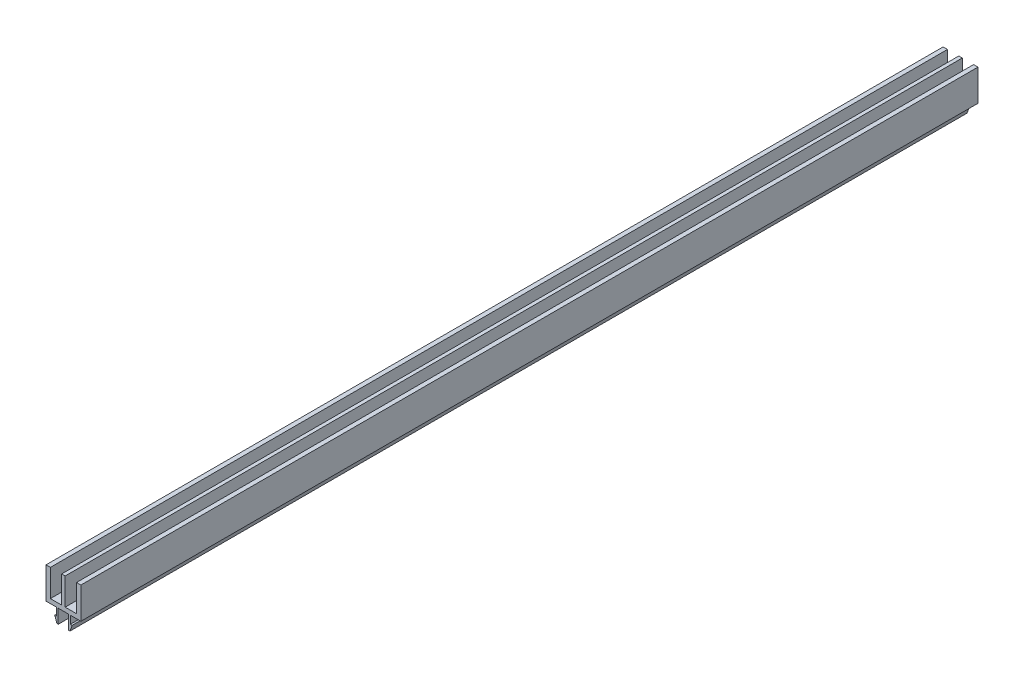
ISO-10303-21;
HEADER;
FILE_DESCRIPTION(('STEP AP214'),'2;1');
FILE_NAME('part.step','',(''),(''),'','','');
FILE_SCHEMA(('AUTOMOTIVE_DESIGN { 1 0 10303 214 1 1 1 1 }'));
ENDSEC;
DATA;
#1=APPLICATION_CONTEXT('core data for automotive mechanical design processes');
#2=APPLICATION_PROTOCOL_DEFINITION('international standard','automotive_design',2000,#1);
#3=PRODUCT_CONTEXT('',#1,'mechanical');
#4=PRODUCT('Part','Part','',(#3));
#5=PRODUCT_RELATED_PRODUCT_CATEGORY('part','',(#4));
#6=PRODUCT_DEFINITION_FORMATION('','',#4);
#7=PRODUCT_DEFINITION_CONTEXT('part definition',#1,'design');
#8=PRODUCT_DEFINITION('design','',#6,#7);
#9=PRODUCT_DEFINITION_SHAPE('','',#8);
#10=(LENGTH_UNIT() NAMED_UNIT(*) SI_UNIT(.MILLI.,.METRE.));
#11=(NAMED_UNIT(*) PLANE_ANGLE_UNIT() SI_UNIT($,.RADIAN.));
#12=(NAMED_UNIT(*) SI_UNIT($,.STERADIAN.) SOLID_ANGLE_UNIT());
#13=UNCERTAINTY_MEASURE_WITH_UNIT(LENGTH_MEASURE(1.E-05),#10,'distance_accuracy_value','');
#14=(GEOMETRIC_REPRESENTATION_CONTEXT(3) GLOBAL_UNCERTAINTY_ASSIGNED_CONTEXT((#13)) GLOBAL_UNIT_ASSIGNED_CONTEXT((#10,
#11,#12)) REPRESENTATION_CONTEXT('',''));
#15=CARTESIAN_POINT('',(0.,0.,0.));
#16=DIRECTION('',(0.,0.,1.));
#17=DIRECTION('',(1.,0.,0.));
#18=AXIS2_PLACEMENT_3D('',#15,#16,#17);
#19=CARTESIAN_POINT('',(-1.,17.9999999975,-464.));
#20=DIRECTION('',(-1.,0.,0.));
#21=DIRECTION('',(0.,-1.,0.));
#22=AXIS2_PLACEMENT_3D('',#19,#20,#21);
#23=PLANE('',#22);
#24=DIRECTION('',(0.,-1.,0.));
#25=VECTOR('',#24,1.);
#26=CARTESIAN_POINT('',(-1.,17.9999999975,50.));
#27=LINE('',#26,#25);
#28=CARTESIAN_POINT('',(-1.,17.9999999975,50.));
#29=VERTEX_POINT('',#28);
#30=CARTESIAN_POINT('',(-1.,2.4999999995,50.));
#31=VERTEX_POINT('',#30);
#32=EDGE_CURVE('E226',#29,#31,#27,.T.);
#33=ORIENTED_EDGE('',*,*,#32,.F.);
#34=DIRECTION('',(0.,0.,1.));
#35=VECTOR('',#34,1.);
#36=CARTESIAN_POINT('',(-1.,17.9999999975,-464.));
#37=LINE('',#36,#35);
#38=CARTESIAN_POINT('',(-1.,17.9999999975,-464.));
#39=VERTEX_POINT('',#38);
#40=EDGE_CURVE('E11',#39,#29,#37,.T.);
#41=ORIENTED_EDGE('',*,*,#40,.F.);
#42=DIRECTION('',(0.,-1.,0.));
#43=VECTOR('',#42,1.);
#44=CARTESIAN_POINT('',(-1.,17.9999999975,-464.));
#45=LINE('',#44,#43);
#46=CARTESIAN_POINT('',(-1.,2.4999999995,-464.));
#47=VERTEX_POINT('',#46);
#48=EDGE_CURVE('E294',#39,#47,#45,.T.);
#49=ORIENTED_EDGE('',*,*,#48,.T.);
#50=DIRECTION('',(0.,0.,1.));
#51=VECTOR('',#50,1.);
#52=CARTESIAN_POINT('',(-1.,2.4999999995,-464.));
#53=LINE('',#52,#51);
#54=EDGE_CURVE('E36',#47,#31,#53,.T.);
#55=ORIENTED_EDGE('',*,*,#54,.T.);
#56=EDGE_LOOP('',(#33,#41,#49,#55));
#57=FACE_BOUND('',#56,.T.);
#58=ADVANCED_FACE('F33',(#57),#23,.T.);
#59=CARTESIAN_POINT('',(0.999999999999998,17.9999999975,-464.));
#60=DIRECTION('',(0.,1.,0.));
#61=DIRECTION('',(0.,0.,1.));
#62=AXIS2_PLACEMENT_3D('',#59,#60,#61);
#63=PLANE('',#62);
#64=DIRECTION('',(-1.,0.,0.));
#65=VECTOR('',#64,1.);
#66=CARTESIAN_POINT('',(0.999999999999998,17.9999999975,50.));
#67=LINE('',#66,#65);
#68=CARTESIAN_POINT('',(0.999999999999998,17.9999999975,50.));
#69=VERTEX_POINT('',#68);
#70=EDGE_CURVE('E292',#69,#29,#67,.T.);
#71=ORIENTED_EDGE('',*,*,#70,.F.);
#72=DIRECTION('',(0.,0.,1.));
#73=VECTOR('',#72,1.);
#74=CARTESIAN_POINT('',(0.999999999999998,17.9999999975,-464.));
#75=LINE('',#74,#73);
#76=CARTESIAN_POINT('',(0.999999999999998,17.9999999975,-464.));
#77=VERTEX_POINT('',#76);
#78=EDGE_CURVE('E42',#77,#69,#75,.T.);
#79=ORIENTED_EDGE('',*,*,#78,.F.);
#80=DIRECTION('',(-1.,0.,0.));
#81=VECTOR('',#80,1.);
#82=CARTESIAN_POINT('',(0.999999999999998,17.9999999975,-464.));
#83=LINE('',#82,#81);
#84=EDGE_CURVE('E216',#77,#39,#83,.T.);
#85=ORIENTED_EDGE('',*,*,#84,.T.);
#86=ORIENTED_EDGE('',*,*,#40,.T.);
#87=EDGE_LOOP('',(#71,#79,#85,#86));
#88=FACE_BOUND('',#87,.T.);
#89=ADVANCED_FACE('F338',(#88),#63,.T.);
#90=CARTESIAN_POINT('',(0.999999999999998,2.4999999995,-464.));
#91=DIRECTION('',(1.,0.,0.));
#92=DIRECTION('',(0.,0.,-1.));
#93=AXIS2_PLACEMENT_3D('',#90,#91,#92);
#94=PLANE('',#93);
#95=DIRECTION('',(0.,1.,0.));
#96=VECTOR('',#95,1.);
#97=CARTESIAN_POINT('',(0.999999999999998,2.4999999995,50.));
#98=LINE('',#97,#96);
#99=CARTESIAN_POINT('',(0.999999999999998,2.4999999995,50.));
#100=VERTEX_POINT('',#99);
#101=EDGE_CURVE('E203',#100,#69,#98,.T.);
#102=ORIENTED_EDGE('',*,*,#101,.F.);
#103=DIRECTION('',(0.,0.,1.));
#104=VECTOR('',#103,1.);
#105=CARTESIAN_POINT('',(0.999999999999998,2.4999999995,-464.));
#106=LINE('',#105,#104);
#107=CARTESIAN_POINT('',(0.999999999999998,2.4999999995,-464.));
#108=VERTEX_POINT('',#107);
#109=EDGE_CURVE('E198',#108,#100,#106,.T.);
#110=ORIENTED_EDGE('',*,*,#109,.F.);
#111=DIRECTION('',(0.,1.,0.));
#112=VECTOR('',#111,1.);
#113=CARTESIAN_POINT('',(0.999999999999998,2.4999999995,-464.));
#114=LINE('',#113,#112);
#115=EDGE_CURVE('E201',#108,#77,#114,.T.);
#116=ORIENTED_EDGE('',*,*,#115,.T.);
#117=ORIENTED_EDGE('',*,*,#78,.T.);
#118=EDGE_LOOP('',(#102,#110,#116,#117));
#119=FACE_BOUND('',#118,.T.);
#120=ADVANCED_FACE('F200',(#119),#94,.T.);
#121=CARTESIAN_POINT('',(7.5,2.4999999995,-464.));
#122=DIRECTION('',(0.,1.,0.));
#123=DIRECTION('',(-1.,0.,0.));
#124=AXIS2_PLACEMENT_3D('',#121,#122,#123);
#125=PLANE('',#124);
#126=DIRECTION('',(-1.,0.,0.));
#127=VECTOR('',#126,1.);
#128=CARTESIAN_POINT('',(7.5,2.4999999995,50.));
#129=LINE('',#128,#127);
#130=CARTESIAN_POINT('',(7.5,2.4999999995,50.));
#131=VERTEX_POINT('',#130);
#132=EDGE_CURVE('E289',#131,#100,#129,.T.);
#133=ORIENTED_EDGE('',*,*,#132,.F.);
#134=DIRECTION('',(0.,0.,1.));
#135=VECTOR('',#134,1.);
#136=CARTESIAN_POINT('',(7.5,2.4999999995,-464.));
#137=LINE('',#136,#135);
#138=CARTESIAN_POINT('',(7.5,2.4999999995,-464.));
#139=VERTEX_POINT('',#138);
#140=EDGE_CURVE('E208',#139,#131,#137,.T.);
#141=ORIENTED_EDGE('',*,*,#140,.F.);
#142=DIRECTION('',(-1.,0.,0.));
#143=VECTOR('',#142,1.);
#144=CARTESIAN_POINT('',(7.5,2.4999999995,-464.));
#145=LINE('',#144,#143);
#146=EDGE_CURVE('E214',#139,#108,#145,.T.);
#147=ORIENTED_EDGE('',*,*,#146,.T.);
#148=ORIENTED_EDGE('',*,*,#109,.T.);
#149=EDGE_LOOP('',(#133,#141,#147,#148));
#150=FACE_BOUND('',#149,.T.);
#151=ADVANCED_FACE('F218',(#150),#125,.T.);
#152=CARTESIAN_POINT('',(7.5,17.9999999975,-464.));
#153=DIRECTION('',(-1.,0.,0.));
#154=DIRECTION('',(0.,-1.,0.));
#155=AXIS2_PLACEMENT_3D('',#152,#153,#154);
#156=PLANE('',#155);
#157=DIRECTION('',(0.,-1.,0.));
#158=VECTOR('',#157,1.);
#159=CARTESIAN_POINT('',(7.5,17.9999999975,50.));
#160=LINE('',#159,#158);
#161=CARTESIAN_POINT('',(7.5,17.9999999975,50.));
#162=VERTEX_POINT('',#161);
#163=EDGE_CURVE('E286',#162,#131,#160,.T.);
#164=ORIENTED_EDGE('',*,*,#163,.F.);
#165=DIRECTION('',(0.,0.,1.));
#166=VECTOR('',#165,1.);
#167=CARTESIAN_POINT('',(7.5,17.9999999975,-464.));
#168=LINE('',#167,#166);
#169=CARTESIAN_POINT('',(7.5,17.9999999975,-464.));
#170=VERTEX_POINT('',#169);
#171=EDGE_CURVE('E298',#170,#162,#168,.T.);
#172=ORIENTED_EDGE('',*,*,#171,.F.);
#173=DIRECTION('',(0.,-1.,0.));
#174=VECTOR('',#173,1.);
#175=CARTESIAN_POINT('',(7.5,17.9999999975,-464.));
#176=LINE('',#175,#174);
#177=EDGE_CURVE('E219',#170,#139,#176,.T.);
#178=ORIENTED_EDGE('',*,*,#177,.T.);
#179=ORIENTED_EDGE('',*,*,#140,.T.);
#180=EDGE_LOOP('',(#164,#172,#178,#179));
#181=FACE_BOUND('',#180,.T.);
#182=ADVANCED_FACE('F351',(#181),#156,.T.);
#183=CARTESIAN_POINT('',(10.,17.9999999975,-464.));
#184=DIRECTION('',(0.,1.,0.));
#185=DIRECTION('',(0.,0.,1.));
#186=AXIS2_PLACEMENT_3D('',#183,#184,#185);
#187=PLANE('',#186);
#188=DIRECTION('',(-1.,0.,0.));
#189=VECTOR('',#188,1.);
#190=CARTESIAN_POINT('',(10.,17.9999999975,50.));
#191=LINE('',#190,#189);
#192=CARTESIAN_POINT('',(10.,17.9999999975,50.));
#193=VERTEX_POINT('',#192);
#194=EDGE_CURVE('E283',#193,#162,#191,.T.);
#195=ORIENTED_EDGE('',*,*,#194,.F.);
#196=DIRECTION('',(0.,0.,1.));
#197=VECTOR('',#196,1.);
#198=CARTESIAN_POINT('',(10.,17.9999999975,-464.));
#199=LINE('',#198,#197);
#200=CARTESIAN_POINT('',(10.,17.9999999975,-464.));
#201=VERTEX_POINT('',#200);
#202=EDGE_CURVE('E300',#201,#193,#199,.T.);
#203=ORIENTED_EDGE('',*,*,#202,.F.);
#204=DIRECTION('',(-1.,0.,0.));
#205=VECTOR('',#204,1.);
#206=CARTESIAN_POINT('',(10.,17.9999999975,-464.));
#207=LINE('',#206,#205);
#208=EDGE_CURVE('E221',#201,#170,#207,.T.);
#209=ORIENTED_EDGE('',*,*,#208,.T.);
#210=ORIENTED_EDGE('',*,*,#171,.T.);
#211=EDGE_LOOP('',(#195,#203,#209,#210));
#212=FACE_BOUND('',#211,.T.);
#213=ADVANCED_FACE('F354',(#212),#187,.T.);
#214=CARTESIAN_POINT('',(10.,-4.99999828349541E-10,-464.));
#215=DIRECTION('',(1.,0.,0.));
#216=DIRECTION('',(0.,0.,-1.));
#217=AXIS2_PLACEMENT_3D('',#214,#215,#216);
#218=PLANE('',#217);
#219=DIRECTION('',(0.,1.,0.));
#220=VECTOR('',#219,1.);
#221=CARTESIAN_POINT('',(10.,-4.99999828349541E-10,50.));
#222=LINE('',#221,#220);
#223=CARTESIAN_POINT('',(10.,-4.99999828349541E-10,50.));
#224=VERTEX_POINT('',#223);
#225=EDGE_CURVE('E280',#224,#193,#222,.T.);
#226=ORIENTED_EDGE('',*,*,#225,.F.);
#227=DIRECTION('',(0.,0.,1.));
#228=VECTOR('',#227,1.);
#229=CARTESIAN_POINT('',(10.,-4.99999828349541E-10,-464.));
#230=LINE('',#229,#228);
#231=CARTESIAN_POINT('',(10.,-4.99999828349541E-10,-464.));
#232=VERTEX_POINT('',#231);
#233=EDGE_CURVE('E302',#232,#224,#230,.T.);
#234=ORIENTED_EDGE('',*,*,#233,.F.);
#235=DIRECTION('',(0.,1.,0.));
#236=VECTOR('',#235,1.);
#237=CARTESIAN_POINT('',(10.,-4.99999828349541E-10,-464.));
#238=LINE('',#237,#236);
#239=EDGE_CURVE('E644',#232,#201,#238,.T.);
#240=ORIENTED_EDGE('',*,*,#239,.T.);
#241=ORIENTED_EDGE('',*,*,#202,.T.);
#242=EDGE_LOOP('',(#226,#234,#240,#241));
#243=FACE_BOUND('',#242,.T.);
#244=ADVANCED_FACE('F358',(#243),#218,.T.);
#245=CARTESIAN_POINT('',(4.,-4.99999998002099E-10,-464.));
#246=DIRECTION('',(0.,-1.,0.));
#247=DIRECTION('',(1.,0.,0.));
#248=AXIS2_PLACEMENT_3D('',#245,#246,#247);
#249=PLANE('',#248);
#250=DIRECTION('',(1.,0.,0.));
#251=VECTOR('',#250,1.);
#252=CARTESIAN_POINT('',(4.,-4.99999998002099E-10,50.));
#253=LINE('',#252,#251);
#254=CARTESIAN_POINT('',(4.,-4.99999998002099E-10,50.));
#255=VERTEX_POINT('',#254);
#256=EDGE_CURVE('E277',#255,#224,#253,.T.);
#257=ORIENTED_EDGE('',*,*,#256,.F.);
#258=DIRECTION('',(0.,0.,1.));
#259=VECTOR('',#258,1.);
#260=CARTESIAN_POINT('',(4.,-4.99999998002099E-10,-464.));
#261=LINE('',#260,#259);
#262=CARTESIAN_POINT('',(4.,-4.99999998002099E-10,-464.));
#263=VERTEX_POINT('',#262);
#264=EDGE_CURVE('E304',#263,#255,#261,.T.);
#265=ORIENTED_EDGE('',*,*,#264,.F.);
#266=DIRECTION('',(1.,0.,0.));
#267=VECTOR('',#266,1.);
#268=CARTESIAN_POINT('',(4.,-4.99999998002099E-10,-464.));
#269=LINE('',#268,#267);
#270=EDGE_CURVE('E648',#263,#232,#269,.T.);
#271=ORIENTED_EDGE('',*,*,#270,.T.);
#272=ORIENTED_EDGE('',*,*,#233,.T.);
#273=EDGE_LOOP('',(#257,#265,#271,#272));
#274=FACE_BOUND('',#273,.T.);
#275=ADVANCED_FACE('F362',(#274),#249,.T.);
#276=CARTESIAN_POINT('',(4.,-4.5,-464.));
#277=DIRECTION('',(1.,0.,0.));
#278=DIRECTION('',(0.,0.,-1.));
#279=AXIS2_PLACEMENT_3D('',#276,#277,#278);
#280=PLANE('',#279);
#281=DIRECTION('',(0.,1.,0.));
#282=VECTOR('',#281,1.);
#283=CARTESIAN_POINT('',(4.,-4.5,50.));
#284=LINE('',#283,#282);
#285=CARTESIAN_POINT('',(4.,-4.5,50.));
#286=VERTEX_POINT('',#285);
#287=EDGE_CURVE('E274',#286,#255,#284,.T.);
#288=ORIENTED_EDGE('',*,*,#287,.F.);
#289=DIRECTION('',(0.,0.,1.));
#290=VECTOR('',#289,1.);
#291=CARTESIAN_POINT('',(4.,-4.5,-464.));
#292=LINE('',#291,#290);
#293=CARTESIAN_POINT('',(4.,-4.5,-464.));
#294=VERTEX_POINT('',#293);
#295=EDGE_CURVE('E306',#294,#286,#292,.T.);
#296=ORIENTED_EDGE('',*,*,#295,.F.);
#297=DIRECTION('',(0.,1.,0.));
#298=VECTOR('',#297,1.);
#299=CARTESIAN_POINT('',(4.,-4.5,-464.));
#300=LINE('',#299,#298);
#301=EDGE_CURVE('E637',#294,#263,#300,.T.);
#302=ORIENTED_EDGE('',*,*,#301,.T.);
#303=ORIENTED_EDGE('',*,*,#264,.T.);
#304=EDGE_LOOP('',(#288,#296,#302,#303));
#305=FACE_BOUND('',#304,.T.);
#306=ADVANCED_FACE('F366',(#305),#280,.T.);
#307=CARTESIAN_POINT('',(5.,-4.5,-464.));
#308=DIRECTION('',(0.,1.,0.));
#309=DIRECTION('',(0.,0.,1.));
#310=AXIS2_PLACEMENT_3D('',#307,#308,#309);
#311=PLANE('',#310);
#312=DIRECTION('',(-1.,0.,0.));
#313=VECTOR('',#312,1.);
#314=CARTESIAN_POINT('',(5.,-4.5,50.));
#315=LINE('',#314,#313);
#316=CARTESIAN_POINT('',(5.,-4.5,50.));
#317=VERTEX_POINT('',#316);
#318=EDGE_CURVE('E271',#317,#286,#315,.T.);
#319=ORIENTED_EDGE('',*,*,#318,.F.);
#320=DIRECTION('',(0.,0.,1.));
#321=VECTOR('',#320,1.);
#322=CARTESIAN_POINT('',(5.,-4.5,-464.));
#323=LINE('',#322,#321);
#324=CARTESIAN_POINT('',(5.,-4.5,-464.));
#325=VERTEX_POINT('',#324);
#326=EDGE_CURVE('E308',#325,#317,#323,.T.);
#327=ORIENTED_EDGE('',*,*,#326,.F.);
#328=DIRECTION('',(-1.,0.,0.));
#329=VECTOR('',#328,1.);
#330=CARTESIAN_POINT('',(5.,-4.5,-464.));
#331=LINE('',#330,#329);
#332=EDGE_CURVE('E633',#325,#294,#331,.T.);
#333=ORIENTED_EDGE('',*,*,#332,.T.);
#334=ORIENTED_EDGE('',*,*,#295,.T.);
#335=EDGE_LOOP('',(#319,#327,#333,#334));
#336=FACE_BOUND('',#335,.T.);
#337=ADVANCED_FACE('F370',(#336),#311,.T.);
#338=CARTESIAN_POINT('',(3.75,-8.,-464.));
#339=DIRECTION('',(0.941741911594837,-0.336336396998156,0.));
#340=DIRECTION('',(0.336336396998157,0.941741911594837,0.));
#341=AXIS2_PLACEMENT_3D('',#338,#339,#340);
#342=PLANE('',#341);
#343=DIRECTION('',(0.336336396998157,0.941741911594837,0.));
#344=VECTOR('',#343,1.);
#345=CARTESIAN_POINT('',(3.75,-8.,50.));
#346=LINE('',#345,#344);
#347=CARTESIAN_POINT('',(3.75,-8.,50.));
#348=VERTEX_POINT('',#347);
#349=EDGE_CURVE('E268',#348,#317,#346,.T.);
#350=ORIENTED_EDGE('',*,*,#349,.F.);
#351=DIRECTION('',(0.,0.,1.));
#352=VECTOR('',#351,1.);
#353=CARTESIAN_POINT('',(3.75,-8.,-464.));
#354=LINE('',#353,#352);
#355=CARTESIAN_POINT('',(3.75,-8.,-464.));
#356=VERTEX_POINT('',#355);
#357=EDGE_CURVE('E310',#356,#348,#354,.T.);
#358=ORIENTED_EDGE('',*,*,#357,.F.);
#359=DIRECTION('',(0.336336396998157,0.941741911594837,0.));
#360=VECTOR('',#359,1.);
#361=CARTESIAN_POINT('',(3.75,-8.,-464.));
#362=LINE('',#361,#360);
#363=EDGE_CURVE('E654',#356,#325,#362,.T.);
#364=ORIENTED_EDGE('',*,*,#363,.T.);
#365=ORIENTED_EDGE('',*,*,#326,.T.);
#366=EDGE_LOOP('',(#350,#358,#364,#365));
#367=FACE_BOUND('',#366,.T.);
#368=ADVANCED_FACE('F374',(#367),#342,.T.);
#369=CARTESIAN_POINT('',(3.,-8.,-464.));
#370=DIRECTION('',(0.,-1.,0.));
#371=DIRECTION('',(0.,0.,-1.));
#372=AXIS2_PLACEMENT_3D('',#369,#370,#371);
#373=PLANE('',#372);
#374=DIRECTION('',(1.,0.,0.));
#375=VECTOR('',#374,1.);
#376=CARTESIAN_POINT('',(3.,-8.,50.));
#377=LINE('',#376,#375);
#378=CARTESIAN_POINT('',(3.,-8.,50.));
#379=VERTEX_POINT('',#378);
#380=EDGE_CURVE('E265',#379,#348,#377,.T.);
#381=ORIENTED_EDGE('',*,*,#380,.F.);
#382=DIRECTION('',(0.,0.,1.));
#383=VECTOR('',#382,1.);
#384=CARTESIAN_POINT('',(3.,-8.,-464.));
#385=LINE('',#384,#383);
#386=CARTESIAN_POINT('',(3.,-8.,-464.));
#387=VERTEX_POINT('',#386);
#388=EDGE_CURVE('E312',#387,#379,#385,.T.);
#389=ORIENTED_EDGE('',*,*,#388,.F.);
#390=DIRECTION('',(1.,0.,0.));
#391=VECTOR('',#390,1.);
#392=CARTESIAN_POINT('',(3.,-8.,-464.));
#393=LINE('',#392,#391);
#394=EDGE_CURVE('E626',#387,#356,#393,.T.);
#395=ORIENTED_EDGE('',*,*,#394,.T.);
#396=ORIENTED_EDGE('',*,*,#357,.T.);
#397=EDGE_LOOP('',(#381,#389,#395,#396));
#398=FACE_BOUND('',#397,.T.);
#399=ADVANCED_FACE('F378',(#398),#373,.T.);
#400=CARTESIAN_POINT('',(3.,-4.9999985194348E-10,-464.));
#401=DIRECTION('',(-1.,0.,0.));
#402=DIRECTION('',(0.,0.,1.));
#403=AXIS2_PLACEMENT_3D('',#400,#401,#402);
#404=PLANE('',#403);
#405=DIRECTION('',(0.,-1.,0.));
#406=VECTOR('',#405,1.);
#407=CARTESIAN_POINT('',(3.,-4.9999985194348E-10,50.));
#408=LINE('',#407,#406);
#409=CARTESIAN_POINT('',(3.,-4.9999985194348E-10,50.));
#410=VERTEX_POINT('',#409);
#411=EDGE_CURVE('E262',#410,#379,#408,.T.);
#412=ORIENTED_EDGE('',*,*,#411,.F.);
#413=DIRECTION('',(0.,0.,1.));
#414=VECTOR('',#413,1.);
#415=CARTESIAN_POINT('',(3.,-4.9999985194348E-10,-464.));
#416=LINE('',#415,#414);
#417=CARTESIAN_POINT('',(3.,-4.9999985194348E-10,-464.));
#418=VERTEX_POINT('',#417);
#419=EDGE_CURVE('E314',#418,#410,#416,.T.);
#420=ORIENTED_EDGE('',*,*,#419,.F.);
#421=DIRECTION('',(0.,-1.,0.));
#422=VECTOR('',#421,1.);
#423=CARTESIAN_POINT('',(3.,-4.9999985194348E-10,-464.));
#424=LINE('',#423,#422);
#425=EDGE_CURVE('E622',#418,#387,#424,.T.);
#426=ORIENTED_EDGE('',*,*,#425,.T.);
#427=ORIENTED_EDGE('',*,*,#388,.T.);
#428=EDGE_LOOP('',(#412,#420,#426,#427));
#429=FACE_BOUND('',#428,.T.);
#430=ADVANCED_FACE('F382',(#429),#404,.T.);
#431=CARTESIAN_POINT('',(-3.,-4.99999455901012E-10,-464.));
#432=DIRECTION('',(0.,-1.,0.));
#433=DIRECTION('',(1.,0.,0.));
#434=AXIS2_PLACEMENT_3D('',#431,#432,#433);
#435=PLANE('',#434);
#436=DIRECTION('',(1.,0.,0.));
#437=VECTOR('',#436,1.);
#438=CARTESIAN_POINT('',(-3.,-4.99999455901012E-10,50.));
#439=LINE('',#438,#437);
#440=CARTESIAN_POINT('',(-3.,-4.99999455901012E-10,50.));
#441=VERTEX_POINT('',#440);
#442=EDGE_CURVE('E259',#441,#410,#439,.T.);
#443=ORIENTED_EDGE('',*,*,#442,.F.);
#444=DIRECTION('',(0.,0.,1.));
#445=VECTOR('',#444,1.);
#446=CARTESIAN_POINT('',(-3.,-4.99999455901012E-10,-464.));
#447=LINE('',#446,#445);
#448=CARTESIAN_POINT('',(-3.,-4.99999455901012E-10,-464.));
#449=VERTEX_POINT('',#448);
#450=EDGE_CURVE('E316',#449,#441,#447,.T.);
#451=ORIENTED_EDGE('',*,*,#450,.F.);
#452=DIRECTION('',(1.,0.,0.));
#453=VECTOR('',#452,1.);
#454=CARTESIAN_POINT('',(-3.,-4.99999455901012E-10,-464.));
#455=LINE('',#454,#453);
#456=EDGE_CURVE('E658',#449,#418,#455,.T.);
#457=ORIENTED_EDGE('',*,*,#456,.T.);
#458=ORIENTED_EDGE('',*,*,#419,.T.);
#459=EDGE_LOOP('',(#443,#451,#457,#458));
#460=FACE_BOUND('',#459,.T.);
#461=ADVANCED_FACE('F386',(#460),#435,.T.);
#462=CARTESIAN_POINT('',(-3.,-8.,-464.));
#463=DIRECTION('',(1.,0.,0.));
#464=DIRECTION('',(0.,0.,-1.));
#465=AXIS2_PLACEMENT_3D('',#462,#463,#464);
#466=PLANE('',#465);
#467=DIRECTION('',(0.,1.,0.));
#468=VECTOR('',#467,1.);
#469=CARTESIAN_POINT('',(-3.,-8.,50.));
#470=LINE('',#469,#468);
#471=CARTESIAN_POINT('',(-3.,-8.,50.));
#472=VERTEX_POINT('',#471);
#473=EDGE_CURVE('E256',#472,#441,#470,.T.);
#474=ORIENTED_EDGE('',*,*,#473,.F.);
#475=DIRECTION('',(0.,0.,1.));
#476=VECTOR('',#475,1.);
#477=CARTESIAN_POINT('',(-3.,-8.,-464.));
#478=LINE('',#477,#476);
#479=CARTESIAN_POINT('',(-3.,-8.,-464.));
#480=VERTEX_POINT('',#479);
#481=EDGE_CURVE('E318',#480,#472,#478,.T.);
#482=ORIENTED_EDGE('',*,*,#481,.F.);
#483=DIRECTION('',(0.,1.,0.));
#484=VECTOR('',#483,1.);
#485=CARTESIAN_POINT('',(-3.,-8.,-464.));
#486=LINE('',#485,#484);
#487=EDGE_CURVE('E615',#480,#449,#486,.T.);
#488=ORIENTED_EDGE('',*,*,#487,.T.);
#489=ORIENTED_EDGE('',*,*,#450,.T.);
#490=EDGE_LOOP('',(#474,#482,#488,#489));
#491=FACE_BOUND('',#490,.T.);
#492=ADVANCED_FACE('F390',(#491),#466,.T.);
#493=CARTESIAN_POINT('',(-3.75,-8.,-464.));
#494=DIRECTION('',(0.,-1.,0.));
#495=DIRECTION('',(0.,0.,-1.));
#496=AXIS2_PLACEMENT_3D('',#493,#494,#495);
#497=PLANE('',#496);
#498=DIRECTION('',(1.,0.,0.));
#499=VECTOR('',#498,1.);
#500=CARTESIAN_POINT('',(-3.75,-8.,50.));
#501=LINE('',#500,#499);
#502=CARTESIAN_POINT('',(-3.75,-8.,50.));
#503=VERTEX_POINT('',#502);
#504=EDGE_CURVE('E253',#503,#472,#501,.T.);
#505=ORIENTED_EDGE('',*,*,#504,.F.);
#506=DIRECTION('',(0.,0.,1.));
#507=VECTOR('',#506,1.);
#508=CARTESIAN_POINT('',(-3.75,-8.,-464.));
#509=LINE('',#508,#507);
#510=CARTESIAN_POINT('',(-3.75,-8.,-464.));
#511=VERTEX_POINT('',#510);
#512=EDGE_CURVE('E320',#511,#503,#509,.T.);
#513=ORIENTED_EDGE('',*,*,#512,.F.);
#514=DIRECTION('',(1.,0.,0.));
#515=VECTOR('',#514,1.);
#516=CARTESIAN_POINT('',(-3.75,-8.,-464.));
#517=LINE('',#516,#515);
#518=EDGE_CURVE('E611',#511,#480,#517,.T.);
#519=ORIENTED_EDGE('',*,*,#518,.T.);
#520=ORIENTED_EDGE('',*,*,#481,.T.);
#521=EDGE_LOOP('',(#505,#513,#519,#520));
#522=FACE_BOUND('',#521,.T.);
#523=ADVANCED_FACE('F394',(#522),#497,.T.);
#524=CARTESIAN_POINT('',(-5.,-4.5,-464.));
#525=DIRECTION('',(-0.941741911594837,-0.336336396998156,0.));
#526=DIRECTION('',(0.336336396998156,-0.941741911594838,0.));
#527=AXIS2_PLACEMENT_3D('',#524,#525,#526);
#528=PLANE('',#527);
#529=DIRECTION('',(0.336336396998156,-0.941741911594837,0.));
#530=VECTOR('',#529,1.);
#531=CARTESIAN_POINT('',(-5.,-4.5,50.));
#532=LINE('',#531,#530);
#533=CARTESIAN_POINT('',(-5.,-4.5,50.));
#534=VERTEX_POINT('',#533);
#535=EDGE_CURVE('E250',#534,#503,#532,.T.);
#536=ORIENTED_EDGE('',*,*,#535,.F.);
#537=DIRECTION('',(0.,0.,1.));
#538=VECTOR('',#537,1.);
#539=CARTESIAN_POINT('',(-5.,-4.5,-464.));
#540=LINE('',#539,#538);
#541=CARTESIAN_POINT('',(-5.,-4.5,-464.));
#542=VERTEX_POINT('',#541);
#543=EDGE_CURVE('E322',#542,#534,#540,.T.);
#544=ORIENTED_EDGE('',*,*,#543,.F.);
#545=DIRECTION('',(0.336336396998156,-0.941741911594837,0.));
#546=VECTOR('',#545,1.);
#547=CARTESIAN_POINT('',(-5.,-4.5,-464.));
#548=LINE('',#547,#546);
#549=EDGE_CURVE('E662',#542,#511,#548,.T.);
#550=ORIENTED_EDGE('',*,*,#549,.T.);
#551=ORIENTED_EDGE('',*,*,#512,.T.);
#552=EDGE_LOOP('',(#536,#544,#550,#551));
#553=FACE_BOUND('',#552,.T.);
#554=ADVANCED_FACE('F398',(#553),#528,.T.);
#555=CARTESIAN_POINT('',(-4.,-4.5,-464.));
#556=DIRECTION('',(0.,1.,0.));
#557=DIRECTION('',(0.,0.,1.));
#558=AXIS2_PLACEMENT_3D('',#555,#556,#557);
#559=PLANE('',#558);
#560=DIRECTION('',(-1.,0.,0.));
#561=VECTOR('',#560,1.);
#562=CARTESIAN_POINT('',(-4.,-4.5,50.));
#563=LINE('',#562,#561);
#564=CARTESIAN_POINT('',(-4.,-4.5,50.));
#565=VERTEX_POINT('',#564);
#566=EDGE_CURVE('E247',#565,#534,#563,.T.);
#567=ORIENTED_EDGE('',*,*,#566,.F.);
#568=DIRECTION('',(0.,0.,1.));
#569=VECTOR('',#568,1.);
#570=CARTESIAN_POINT('',(-4.,-4.5,-464.));
#571=LINE('',#570,#569);
#572=CARTESIAN_POINT('',(-4.,-4.5,-464.));
#573=VERTEX_POINT('',#572);
#574=EDGE_CURVE('E324',#573,#565,#571,.T.);
#575=ORIENTED_EDGE('',*,*,#574,.F.);
#576=DIRECTION('',(-1.,0.,0.));
#577=VECTOR('',#576,1.);
#578=CARTESIAN_POINT('',(-4.,-4.5,-464.));
#579=LINE('',#578,#577);
#580=EDGE_CURVE('E604',#573,#542,#579,.T.);
#581=ORIENTED_EDGE('',*,*,#580,.T.);
#582=ORIENTED_EDGE('',*,*,#543,.T.);
#583=EDGE_LOOP('',(#567,#575,#581,#582));
#584=FACE_BOUND('',#583,.T.);
#585=ADVANCED_FACE('F402',(#584),#559,.T.);
#586=CARTESIAN_POINT('',(-4.,-4.9999985194348E-10,-464.));
#587=DIRECTION('',(-1.,0.,0.));
#588=DIRECTION('',(0.,0.,1.));
#589=AXIS2_PLACEMENT_3D('',#586,#587,#588);
#590=PLANE('',#589);
#591=DIRECTION('',(0.,-1.,0.));
#592=VECTOR('',#591,1.);
#593=CARTESIAN_POINT('',(-4.,-4.9999985194348E-10,50.));
#594=LINE('',#593,#592);
#595=CARTESIAN_POINT('',(-4.,-4.9999985194348E-10,50.));
#596=VERTEX_POINT('',#595);
#597=EDGE_CURVE('E244',#596,#565,#594,.T.);
#598=ORIENTED_EDGE('',*,*,#597,.F.);
#599=DIRECTION('',(0.,0.,1.));
#600=VECTOR('',#599,1.);
#601=CARTESIAN_POINT('',(-4.,-4.9999985194348E-10,-464.));
#602=LINE('',#601,#600);
#603=CARTESIAN_POINT('',(-4.,-4.9999985194348E-10,-464.));
#604=VERTEX_POINT('',#603);
#605=EDGE_CURVE('E326',#604,#596,#602,.T.);
#606=ORIENTED_EDGE('',*,*,#605,.F.);
#607=DIRECTION('',(0.,-1.,0.));
#608=VECTOR('',#607,1.);
#609=CARTESIAN_POINT('',(-4.,-4.9999985194348E-10,-464.));
#610=LINE('',#609,#608);
#611=EDGE_CURVE('E600',#604,#573,#610,.T.);
#612=ORIENTED_EDGE('',*,*,#611,.T.);
#613=ORIENTED_EDGE('',*,*,#574,.T.);
#614=EDGE_LOOP('',(#598,#606,#612,#613));
#615=FACE_BOUND('',#614,.T.);
#616=ADVANCED_FACE('F406',(#615),#590,.T.);
#617=CARTESIAN_POINT('',(-10.,-4.99999719929324E-10,-464.));
#618=DIRECTION('',(0.,-1.,0.));
#619=DIRECTION('',(1.,0.,0.));
#620=AXIS2_PLACEMENT_3D('',#617,#618,#619);
#621=PLANE('',#620);
#622=DIRECTION('',(1.,0.,0.));
#623=VECTOR('',#622,1.);
#624=CARTESIAN_POINT('',(-10.,-4.99999719929324E-10,50.));
#625=LINE('',#624,#623);
#626=CARTESIAN_POINT('',(-10.,-4.99999719929324E-10,50.));
#627=VERTEX_POINT('',#626);
#628=EDGE_CURVE('E241',#627,#596,#625,.T.);
#629=ORIENTED_EDGE('',*,*,#628,.F.);
#630=DIRECTION('',(0.,0.,1.));
#631=VECTOR('',#630,1.);
#632=CARTESIAN_POINT('',(-10.,-4.99999719929324E-10,-464.));
#633=LINE('',#632,#631);
#634=CARTESIAN_POINT('',(-10.,-4.99999719929324E-10,-464.));
#635=VERTEX_POINT('',#634);
#636=EDGE_CURVE('E328',#635,#627,#633,.T.);
#637=ORIENTED_EDGE('',*,*,#636,.F.);
#638=DIRECTION('',(1.,0.,0.));
#639=VECTOR('',#638,1.);
#640=CARTESIAN_POINT('',(-10.,-4.99999719929324E-10,-464.));
#641=LINE('',#640,#639);
#642=EDGE_CURVE('E666',#635,#604,#641,.T.);
#643=ORIENTED_EDGE('',*,*,#642,.T.);
#644=ORIENTED_EDGE('',*,*,#605,.T.);
#645=EDGE_LOOP('',(#629,#637,#643,#644));
#646=FACE_BOUND('',#645,.T.);
#647=ADVANCED_FACE('F410',(#646),#621,.T.);
#648=CARTESIAN_POINT('',(-10.,17.9999999975,-464.));
#649=DIRECTION('',(-1.,0.,0.));
#650=DIRECTION('',(0.,-1.,0.));
#651=AXIS2_PLACEMENT_3D('',#648,#649,#650);
#652=PLANE('',#651);
#653=DIRECTION('',(0.,-1.,0.));
#654=VECTOR('',#653,1.);
#655=CARTESIAN_POINT('',(-10.,17.9999999975,50.));
#656=LINE('',#655,#654);
#657=CARTESIAN_POINT('',(-10.,17.9999999975,50.));
#658=VERTEX_POINT('',#657);
#659=EDGE_CURVE('E238',#658,#627,#656,.T.);
#660=ORIENTED_EDGE('',*,*,#659,.F.);
#661=DIRECTION('',(0.,0.,1.));
#662=VECTOR('',#661,1.);
#663=CARTESIAN_POINT('',(-10.,17.9999999975,-464.));
#664=LINE('',#663,#662);
#665=CARTESIAN_POINT('',(-10.,17.9999999975,-464.));
#666=VERTEX_POINT('',#665);
#667=EDGE_CURVE('E330',#666,#658,#664,.T.);
#668=ORIENTED_EDGE('',*,*,#667,.F.);
#669=DIRECTION('',(0.,-1.,0.));
#670=VECTOR('',#669,1.);
#671=CARTESIAN_POINT('',(-10.,17.9999999975,-464.));
#672=LINE('',#671,#670);
#673=EDGE_CURVE('E593',#666,#635,#672,.T.);
#674=ORIENTED_EDGE('',*,*,#673,.T.);
#675=ORIENTED_EDGE('',*,*,#636,.T.);
#676=EDGE_LOOP('',(#660,#668,#674,#675));
#677=FACE_BOUND('',#676,.T.);
#678=ADVANCED_FACE('F414',(#677),#652,.T.);
#679=CARTESIAN_POINT('',(-7.5,17.9999999975,-464.));
#680=DIRECTION('',(0.,1.,0.));
#681=DIRECTION('',(0.,0.,1.));
#682=AXIS2_PLACEMENT_3D('',#679,#680,#681);
#683=PLANE('',#682);
#684=DIRECTION('',(-1.,0.,0.));
#685=VECTOR('',#684,1.);
#686=CARTESIAN_POINT('',(-7.5,17.9999999975,50.));
#687=LINE('',#686,#685);
#688=CARTESIAN_POINT('',(-7.5,17.9999999975,50.));
#689=VERTEX_POINT('',#688);
#690=EDGE_CURVE('E235',#689,#658,#687,.T.);
#691=ORIENTED_EDGE('',*,*,#690,.F.);
#692=DIRECTION('',(0.,0.,1.));
#693=VECTOR('',#692,1.);
#694=CARTESIAN_POINT('',(-7.5,17.9999999975,-464.));
#695=LINE('',#694,#693);
#696=CARTESIAN_POINT('',(-7.5,17.9999999975,-464.));
#697=VERTEX_POINT('',#696);
#698=EDGE_CURVE('E332',#697,#689,#695,.T.);
#699=ORIENTED_EDGE('',*,*,#698,.F.);
#700=DIRECTION('',(-1.,0.,0.));
#701=VECTOR('',#700,1.);
#702=CARTESIAN_POINT('',(-7.5,17.9999999975,-464.));
#703=LINE('',#702,#701);
#704=EDGE_CURVE('E589',#697,#666,#703,.T.);
#705=ORIENTED_EDGE('',*,*,#704,.T.);
#706=ORIENTED_EDGE('',*,*,#667,.T.);
#707=EDGE_LOOP('',(#691,#699,#705,#706));
#708=FACE_BOUND('',#707,.T.);
#709=ADVANCED_FACE('F418',(#708),#683,.T.);
#710=CARTESIAN_POINT('',(-7.5,2.4999999995,-464.));
#711=DIRECTION('',(1.,0.,0.));
#712=DIRECTION('',(0.,0.,-1.));
#713=AXIS2_PLACEMENT_3D('',#710,#711,#712);
#714=PLANE('',#713);
#715=DIRECTION('',(0.,1.,0.));
#716=VECTOR('',#715,1.);
#717=CARTESIAN_POINT('',(-7.5,2.4999999995,50.));
#718=LINE('',#717,#716);
#719=CARTESIAN_POINT('',(-7.5,2.4999999995,50.));
#720=VERTEX_POINT('',#719);
#721=EDGE_CURVE('E232',#720,#689,#718,.T.);
#722=ORIENTED_EDGE('',*,*,#721,.F.);
#723=DIRECTION('',(0.,0.,1.));
#724=VECTOR('',#723,1.);
#725=CARTESIAN_POINT('',(-7.5,2.4999999995,-464.));
#726=LINE('',#725,#724);
#727=CARTESIAN_POINT('',(-7.5,2.4999999995,-464.));
#728=VERTEX_POINT('',#727);
#729=EDGE_CURVE('E333',#728,#720,#726,.T.);
#730=ORIENTED_EDGE('',*,*,#729,.F.);
#731=DIRECTION('',(0.,1.,0.));
#732=VECTOR('',#731,1.);
#733=CARTESIAN_POINT('',(-7.5,2.4999999995,-464.));
#734=LINE('',#733,#732);
#735=EDGE_CURVE('E670',#728,#697,#734,.T.);
#736=ORIENTED_EDGE('',*,*,#735,.T.);
#737=ORIENTED_EDGE('',*,*,#698,.T.);
#738=EDGE_LOOP('',(#722,#730,#736,#737));
#739=FACE_BOUND('',#738,.T.);
#740=ADVANCED_FACE('F422',(#739),#714,.T.);
#741=CARTESIAN_POINT('',(-1.,2.4999999995,-464.));
#742=DIRECTION('',(0.,1.,0.));
#743=DIRECTION('',(-1.,0.,0.));
#744=AXIS2_PLACEMENT_3D('',#741,#742,#743);
#745=PLANE('',#744);
#746=DIRECTION('',(-1.,0.,0.));
#747=VECTOR('',#746,1.);
#748=CARTESIAN_POINT('',(-1.,2.4999999995,50.));
#749=LINE('',#748,#747);
#750=EDGE_CURVE('E229',#31,#720,#749,.T.);
#751=ORIENTED_EDGE('',*,*,#750,.F.);
#752=ORIENTED_EDGE('',*,*,#54,.F.);
#753=DIRECTION('',(-1.,0.,0.));
#754=VECTOR('',#753,1.);
#755=CARTESIAN_POINT('',(-1.,2.4999999995,-464.));
#756=LINE('',#755,#754);
#757=EDGE_CURVE('E672',#47,#728,#756,.T.);
#758=ORIENTED_EDGE('',*,*,#757,.T.);
#759=ORIENTED_EDGE('',*,*,#729,.T.);
#760=EDGE_LOOP('',(#751,#752,#758,#759));
#761=FACE_BOUND('',#760,.T.);
#762=ADVANCED_FACE('F335',(#761),#745,.T.);
#763=CARTESIAN_POINT('',(0.,0.,-464.));
#764=DIRECTION('',(0.,0.,-1.));
#765=DIRECTION('',(-1.,0.,0.));
#766=AXIS2_PLACEMENT_3D('',#763,#764,#765);
#767=PLANE('',#766);
#768=ORIENTED_EDGE('',*,*,#48,.F.);
#769=ORIENTED_EDGE('',*,*,#84,.F.);
#770=ORIENTED_EDGE('',*,*,#115,.F.);
#771=ORIENTED_EDGE('',*,*,#146,.F.);
#772=ORIENTED_EDGE('',*,*,#177,.F.);
#773=ORIENTED_EDGE('',*,*,#208,.F.);
#774=ORIENTED_EDGE('',*,*,#239,.F.);
#775=ORIENTED_EDGE('',*,*,#270,.F.);
#776=ORIENTED_EDGE('',*,*,#301,.F.);
#777=ORIENTED_EDGE('',*,*,#332,.F.);
#778=ORIENTED_EDGE('',*,*,#363,.F.);
#779=ORIENTED_EDGE('',*,*,#394,.F.);
#780=ORIENTED_EDGE('',*,*,#425,.F.);
#781=ORIENTED_EDGE('',*,*,#456,.F.);
#782=ORIENTED_EDGE('',*,*,#487,.F.);
#783=ORIENTED_EDGE('',*,*,#518,.F.);
#784=ORIENTED_EDGE('',*,*,#549,.F.);
#785=ORIENTED_EDGE('',*,*,#580,.F.);
#786=ORIENTED_EDGE('',*,*,#611,.F.);
#787=ORIENTED_EDGE('',*,*,#642,.F.);
#788=ORIENTED_EDGE('',*,*,#673,.F.);
#789=ORIENTED_EDGE('',*,*,#704,.F.);
#790=ORIENTED_EDGE('',*,*,#735,.F.);
#791=ORIENTED_EDGE('',*,*,#757,.F.);
#792=EDGE_LOOP('',(#768,#769,#770,#771,#772,#773,#774,#775,#776,#777,#778,#779,#780,#781,#782,
#783,#784,#785,#786,#787,#788,#789,#790,#791));
#793=FACE_BOUND('',#792,.T.);
#794=ADVANCED_FACE('F212',(#793),#767,.T.);
#795=CARTESIAN_POINT('',(0.,0.,50.));
#796=DIRECTION('',(0.,0.,-1.));
#797=DIRECTION('',(-1.,0.,0.));
#798=AXIS2_PLACEMENT_3D('',#795,#796,#797);
#799=PLANE('',#798);
#800=ORIENTED_EDGE('',*,*,#32,.T.);
#801=ORIENTED_EDGE('',*,*,#750,.T.);
#802=ORIENTED_EDGE('',*,*,#721,.T.);
#803=ORIENTED_EDGE('',*,*,#690,.T.);
#804=ORIENTED_EDGE('',*,*,#659,.T.);
#805=ORIENTED_EDGE('',*,*,#628,.T.);
#806=ORIENTED_EDGE('',*,*,#597,.T.);
#807=ORIENTED_EDGE('',*,*,#566,.T.);
#808=ORIENTED_EDGE('',*,*,#535,.T.);
#809=ORIENTED_EDGE('',*,*,#504,.T.);
#810=ORIENTED_EDGE('',*,*,#473,.T.);
#811=ORIENTED_EDGE('',*,*,#442,.T.);
#812=ORIENTED_EDGE('',*,*,#411,.T.);
#813=ORIENTED_EDGE('',*,*,#380,.T.);
#814=ORIENTED_EDGE('',*,*,#349,.T.);
#815=ORIENTED_EDGE('',*,*,#318,.T.);
#816=ORIENTED_EDGE('',*,*,#287,.T.);
#817=ORIENTED_EDGE('',*,*,#256,.T.);
#818=ORIENTED_EDGE('',*,*,#225,.T.);
#819=ORIENTED_EDGE('',*,*,#194,.T.);
#820=ORIENTED_EDGE('',*,*,#163,.T.);
#821=ORIENTED_EDGE('',*,*,#132,.T.);
#822=ORIENTED_EDGE('',*,*,#101,.T.);
#823=ORIENTED_EDGE('',*,*,#70,.T.);
#824=EDGE_LOOP('',(#800,#801,#802,#803,#804,#805,#806,#807,#808,#809,#810,#811,#812,#813,#814,
#815,#816,#817,#818,#819,#820,#821,#822,#823));
#825=FACE_BOUND('',#824,.T.);
#826=ADVANCED_FACE('F337',(#825),#799,.F.);
#827=CLOSED_SHELL('',(#58,#89,#120,#151,#182,#213,#244,#275,#306,#337,#368,#399,#430,#461,#492,
#523,#554,#585,#616,#647,#678,#709,#740,#762,#794,#826));
#828=MANIFOLD_SOLID_BREP('B2',#827);
#829=ADVANCED_BREP_SHAPE_REPRESENTATION('',(#18,#828),#14);
#830=SHAPE_DEFINITION_REPRESENTATION(#9,#829);
ENDSEC;
END-ISO-10303-21;
